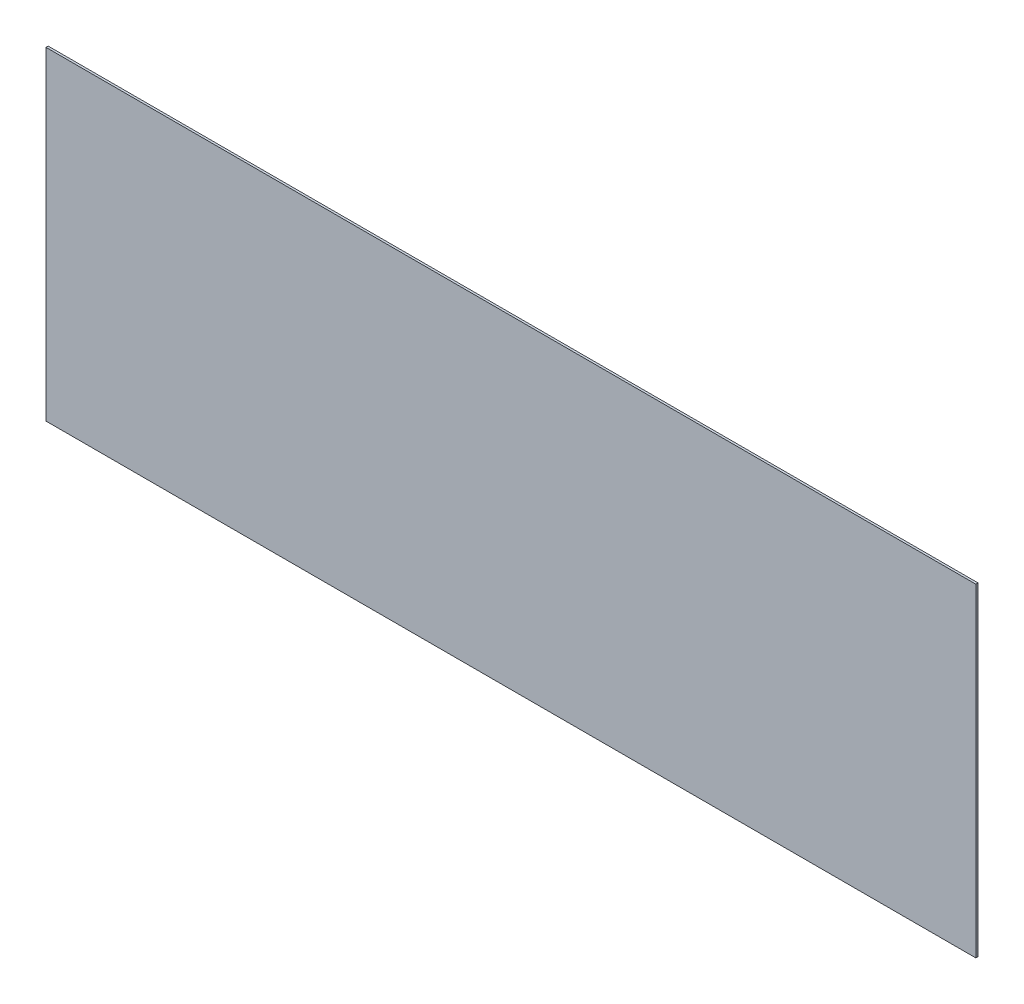
ISO-10303-21;
HEADER;
FILE_DESCRIPTION(('STEP AP214'),'2;1');
FILE_NAME('part.step','',(''),(''),'','','');
FILE_SCHEMA(('AUTOMOTIVE_DESIGN { 1 0 10303 214 1 1 1 1 }'));
ENDSEC;
DATA;
#1=APPLICATION_CONTEXT('core data for automotive mechanical design processes');
#2=APPLICATION_PROTOCOL_DEFINITION('international standard','automotive_design',2000,#1);
#3=PRODUCT_CONTEXT('',#1,'mechanical');
#4=PRODUCT('Part','Part','',(#3));
#5=PRODUCT_RELATED_PRODUCT_CATEGORY('part','',(#4));
#6=PRODUCT_DEFINITION_FORMATION('','',#4);
#7=PRODUCT_DEFINITION_CONTEXT('part definition',#1,'design');
#8=PRODUCT_DEFINITION('design','',#6,#7);
#9=PRODUCT_DEFINITION_SHAPE('','',#8);
#10=(LENGTH_UNIT() NAMED_UNIT(*) SI_UNIT(.MILLI.,.METRE.));
#11=(NAMED_UNIT(*) PLANE_ANGLE_UNIT() SI_UNIT($,.RADIAN.));
#12=(NAMED_UNIT(*) SI_UNIT($,.STERADIAN.) SOLID_ANGLE_UNIT());
#13=UNCERTAINTY_MEASURE_WITH_UNIT(LENGTH_MEASURE(1.E-05),#10,'distance_accuracy_value','');
#14=(GEOMETRIC_REPRESENTATION_CONTEXT(3) GLOBAL_UNCERTAINTY_ASSIGNED_CONTEXT((#13)) GLOBAL_UNIT_ASSIGNED_CONTEXT((#10,
#11,#12)) REPRESENTATION_CONTEXT('',''));
#15=CARTESIAN_POINT('',(0.,0.,0.));
#16=DIRECTION('',(0.,0.,1.));
#17=DIRECTION('',(1.,0.,0.));
#18=AXIS2_PLACEMENT_3D('',#15,#16,#17);
#19=CARTESIAN_POINT('',(325.141548362947,0.,1.));
#20=DIRECTION('',(1.,0.,0.));
#21=DIRECTION('',(0.,0.,-1.));
#22=AXIS2_PLACEMENT_3D('',#19,#20,#21);
#23=PLANE('',#22);
#24=DIRECTION('',(0.,-1.,0.));
#25=VECTOR('',#24,1.);
#26=CARTESIAN_POINT('',(325.141548362947,0.,0.));
#27=LINE('',#26,#25);
#28=CARTESIAN_POINT('',(325.141548362947,147.,0.));
#29=VERTEX_POINT('',#28);
#30=CARTESIAN_POINT('',(325.141548362947,0.,0.));
#31=VERTEX_POINT('',#30);
#32=EDGE_CURVE('E95',#29,#31,#27,.T.);
#33=ORIENTED_EDGE('',*,*,#32,.T.);
#34=DIRECTION('',(0.,0.,-1.));
#35=VECTOR('',#34,1.);
#36=CARTESIAN_POINT('',(325.141548362947,0.,1.));
#37=LINE('',#36,#35);
#38=CARTESIAN_POINT('',(325.141548362947,0.,1.));
#39=VERTEX_POINT('',#38);
#40=EDGE_CURVE('E11',#39,#31,#37,.T.);
#41=ORIENTED_EDGE('',*,*,#40,.F.);
#42=DIRECTION('',(0.,-1.,0.));
#43=VECTOR('',#42,1.);
#44=CARTESIAN_POINT('',(325.141548362947,0.,1.));
#45=LINE('',#44,#43);
#46=CARTESIAN_POINT('',(325.141548362947,147.,1.));
#47=VERTEX_POINT('',#46);
#48=EDGE_CURVE('E83',#47,#39,#45,.T.);
#49=ORIENTED_EDGE('',*,*,#48,.F.);
#50=DIRECTION('',(0.,0.,-1.));
#51=VECTOR('',#50,1.);
#52=CARTESIAN_POINT('',(325.141548362947,147.,1.));
#53=LINE('',#52,#51);
#54=EDGE_CURVE('E91',#47,#29,#53,.T.);
#55=ORIENTED_EDGE('',*,*,#54,.T.);
#56=EDGE_LOOP('',(#33,#41,#49,#55));
#57=FACE_BOUND('',#56,.T.);
#58=ADVANCED_FACE('F32',(#57),#23,.F.);
#59=CARTESIAN_POINT('',(325.141548362947,0.,1.));
#60=DIRECTION('',(0.,1.,0.));
#61=DIRECTION('',(0.,0.,1.));
#62=AXIS2_PLACEMENT_3D('',#59,#60,#61);
#63=PLANE('',#62);
#64=DIRECTION('',(1.,0.,0.));
#65=VECTOR('',#64,1.);
#66=CARTESIAN_POINT('',(325.141548362947,0.,0.));
#67=LINE('',#66,#65);
#68=CARTESIAN_POINT('',(747.4,0.,0.));
#69=VERTEX_POINT('',#68);
#70=EDGE_CURVE('E87',#31,#69,#67,.T.);
#71=ORIENTED_EDGE('',*,*,#70,.T.);
#72=DIRECTION('',(0.,0.,-1.));
#73=VECTOR('',#72,1.);
#74=CARTESIAN_POINT('',(747.4,0.,1.));
#75=LINE('',#74,#73);
#76=CARTESIAN_POINT('',(747.4,0.,1.));
#77=VERTEX_POINT('',#76);
#78=EDGE_CURVE('E40',#77,#69,#75,.T.);
#79=ORIENTED_EDGE('',*,*,#78,.F.);
#80=DIRECTION('',(1.,0.,0.));
#81=VECTOR('',#80,1.);
#82=CARTESIAN_POINT('',(325.141548362947,0.,1.));
#83=LINE('',#82,#81);
#84=EDGE_CURVE('E78',#39,#77,#83,.T.);
#85=ORIENTED_EDGE('',*,*,#84,.F.);
#86=ORIENTED_EDGE('',*,*,#40,.T.);
#87=EDGE_LOOP('',(#71,#79,#85,#86));
#88=FACE_BOUND('',#87,.T.);
#89=ADVANCED_FACE('F86',(#88),#63,.F.);
#90=CARTESIAN_POINT('',(747.4,0.,1.));
#91=DIRECTION('',(-1.,0.,0.));
#92=DIRECTION('',(0.,0.,1.));
#93=AXIS2_PLACEMENT_3D('',#90,#91,#92);
#94=PLANE('',#93);
#95=DIRECTION('',(0.,1.,0.));
#96=VECTOR('',#95,1.);
#97=CARTESIAN_POINT('',(747.4,0.,0.));
#98=LINE('',#97,#96);
#99=CARTESIAN_POINT('',(747.4,147.,0.));
#100=VERTEX_POINT('',#99);
#101=EDGE_CURVE('E65',#69,#100,#98,.T.);
#102=ORIENTED_EDGE('',*,*,#101,.T.);
#103=DIRECTION('',(0.,0.,-1.));
#104=VECTOR('',#103,1.);
#105=CARTESIAN_POINT('',(747.4,147.,1.));
#106=LINE('',#105,#104);
#107=CARTESIAN_POINT('',(747.4,147.,1.));
#108=VERTEX_POINT('',#107);
#109=EDGE_CURVE('E88',#108,#100,#106,.T.);
#110=ORIENTED_EDGE('',*,*,#109,.F.);
#111=DIRECTION('',(0.,1.,0.));
#112=VECTOR('',#111,1.);
#113=CARTESIAN_POINT('',(747.4,0.,1.));
#114=LINE('',#113,#112);
#115=EDGE_CURVE('E81',#77,#108,#114,.T.);
#116=ORIENTED_EDGE('',*,*,#115,.F.);
#117=ORIENTED_EDGE('',*,*,#78,.T.);
#118=EDGE_LOOP('',(#102,#110,#116,#117));
#119=FACE_BOUND('',#118,.T.);
#120=ADVANCED_FACE('F89',(#119),#94,.F.);
#121=CARTESIAN_POINT('',(325.141548362947,147.,1.));
#122=DIRECTION('',(0.,-1.,0.));
#123=DIRECTION('',(0.,0.,-1.));
#124=AXIS2_PLACEMENT_3D('',#121,#122,#123);
#125=PLANE('',#124);
#126=DIRECTION('',(-1.,0.,0.));
#127=VECTOR('',#126,1.);
#128=CARTESIAN_POINT('',(325.141548362947,147.,0.));
#129=LINE('',#128,#127);
#130=EDGE_CURVE('E71',#100,#29,#129,.T.);
#131=ORIENTED_EDGE('',*,*,#130,.T.);
#132=ORIENTED_EDGE('',*,*,#54,.F.);
#133=DIRECTION('',(-1.,0.,0.));
#134=VECTOR('',#133,1.);
#135=CARTESIAN_POINT('',(325.141548362947,147.,1.));
#136=LINE('',#135,#134);
#137=EDGE_CURVE('E48',#108,#47,#136,.T.);
#138=ORIENTED_EDGE('',*,*,#137,.F.);
#139=ORIENTED_EDGE('',*,*,#109,.T.);
#140=EDGE_LOOP('',(#131,#132,#138,#139));
#141=FACE_BOUND('',#140,.T.);
#142=ADVANCED_FACE('F102',(#141),#125,.F.);
#143=CARTESIAN_POINT('',(0.,0.,1.));
#144=DIRECTION('',(0.,0.,-1.));
#145=DIRECTION('',(-1.,0.,0.));
#146=AXIS2_PLACEMENT_3D('',#143,#144,#145);
#147=PLANE('',#146);
#148=ORIENTED_EDGE('',*,*,#48,.T.);
#149=ORIENTED_EDGE('',*,*,#84,.T.);
#150=ORIENTED_EDGE('',*,*,#115,.T.);
#151=ORIENTED_EDGE('',*,*,#137,.T.);
#152=EDGE_LOOP('',(#148,#149,#150,#151));
#153=FACE_BOUND('',#152,.T.);
#154=ADVANCED_FACE('F79',(#153),#147,.F.);
#155=CARTESIAN_POINT('',(0.,0.,0.));
#156=DIRECTION('',(0.,0.,-1.));
#157=DIRECTION('',(-1.,0.,0.));
#158=AXIS2_PLACEMENT_3D('',#155,#156,#157);
#159=PLANE('',#158);
#160=ORIENTED_EDGE('',*,*,#32,.F.);
#161=ORIENTED_EDGE('',*,*,#130,.F.);
#162=ORIENTED_EDGE('',*,*,#101,.F.);
#163=ORIENTED_EDGE('',*,*,#70,.F.);
#164=EDGE_LOOP('',(#160,#161,#162,#163));
#165=FACE_BOUND('',#164,.T.);
#166=ADVANCED_FACE('F105',(#165),#159,.T.);
#167=CLOSED_SHELL('',(#58,#89,#120,#142,#154,#166));
#168=MANIFOLD_SOLID_BREP('B2',#167);
#169=ADVANCED_BREP_SHAPE_REPRESENTATION('',(#18,#168),#14);
#170=SHAPE_DEFINITION_REPRESENTATION(#9,#169);
ENDSEC;
END-ISO-10303-21;
